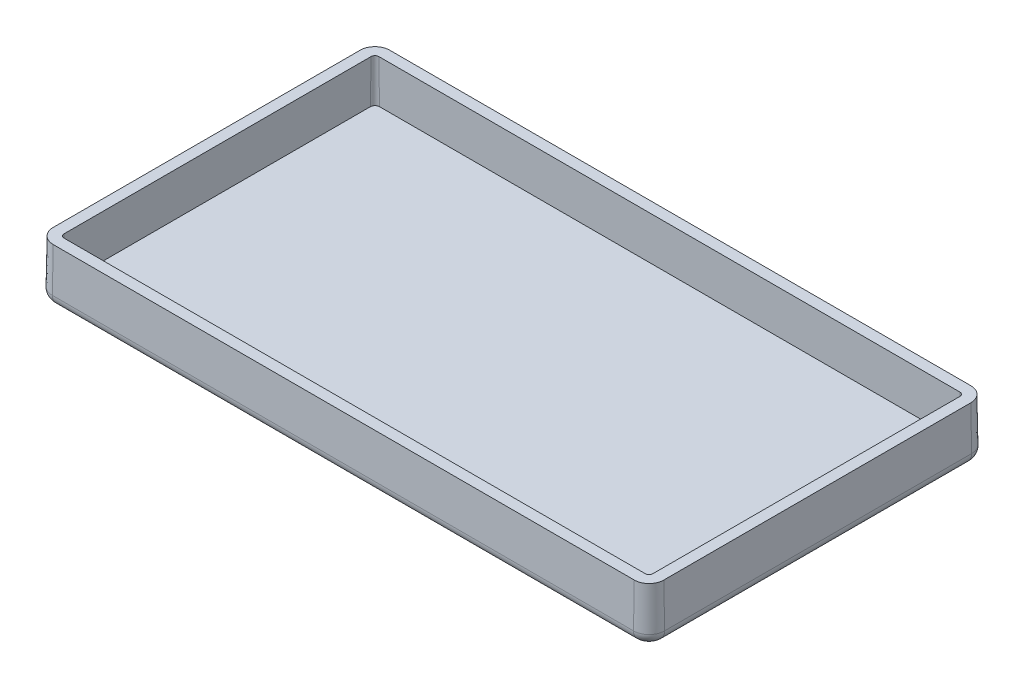
ISO-10303-21;
HEADER;
FILE_DESCRIPTION(('STEP AP214'),'2;1');
FILE_NAME('part.step','',(''),(''),'','','');
FILE_SCHEMA(('AUTOMOTIVE_DESIGN { 1 0 10303 214 1 1 1 1 }'));
ENDSEC;
DATA;
#1=APPLICATION_CONTEXT('core data for automotive mechanical design processes');
#2=APPLICATION_PROTOCOL_DEFINITION('international standard','automotive_design',2000,#1);
#3=PRODUCT_CONTEXT('',#1,'mechanical');
#4=PRODUCT('Part','Part','',(#3));
#5=PRODUCT_RELATED_PRODUCT_CATEGORY('part','',(#4));
#6=PRODUCT_DEFINITION_FORMATION('','',#4);
#7=PRODUCT_DEFINITION_CONTEXT('part definition',#1,'design');
#8=PRODUCT_DEFINITION('design','',#6,#7);
#9=PRODUCT_DEFINITION_SHAPE('','',#8);
#10=(LENGTH_UNIT() NAMED_UNIT(*) SI_UNIT(.MILLI.,.METRE.));
#11=(NAMED_UNIT(*) PLANE_ANGLE_UNIT() SI_UNIT($,.RADIAN.));
#12=(NAMED_UNIT(*) SI_UNIT($,.STERADIAN.) SOLID_ANGLE_UNIT());
#13=UNCERTAINTY_MEASURE_WITH_UNIT(LENGTH_MEASURE(1.E-05),#10,'distance_accuracy_value','');
#14=(GEOMETRIC_REPRESENTATION_CONTEXT(3) GLOBAL_UNCERTAINTY_ASSIGNED_CONTEXT((#13)) GLOBAL_UNIT_ASSIGNED_CONTEXT((#10,
#11,#12)) REPRESENTATION_CONTEXT('',''));
#15=CARTESIAN_POINT('',(0.,0.,0.));
#16=DIRECTION('',(0.,0.,1.));
#17=DIRECTION('',(1.,0.,0.));
#18=AXIS2_PLACEMENT_3D('',#15,#16,#17);
#19=CARTESIAN_POINT('',(0.,10.,0.));
#20=DIRECTION('',(0.,1.,0.));
#21=DIRECTION('',(0.,0.,1.));
#22=AXIS2_PLACEMENT_3D('',#19,#20,#21);
#23=PLANE('',#22);
#24=DIRECTION('',(0.,0.,1.));
#25=VECTOR('',#24,1.);
#26=CARTESIAN_POINT('',(55.6982025971287,10.,-28.));
#27=LINE('',#26,#25);
#28=CARTESIAN_POINT('',(55.6982025971287,10.,28.));
#29=VERTEX_POINT('',#28);
#30=CARTESIAN_POINT('',(55.6982025971287,10.,-28.));
#31=VERTEX_POINT('',#30);
#32=EDGE_CURVE('E175',#29,#31,#27,.F.);
#33=ORIENTED_EDGE('',*,*,#32,.T.);
#34=CARTESIAN_POINT('',(53.,10.,-28.));
#35=DIRECTION('',(0.,1.,0.));
#36=DIRECTION('',(0.,0.,1.));
#37=AXIS2_PLACEMENT_3D('',#34,#35,#36);
#38=CIRCLE('',#37,2.69820259712871);
#39=CARTESIAN_POINT('',(53.,10.,-30.6982025971287));
#40=VERTEX_POINT('',#39);
#41=EDGE_CURVE('E184',#31,#40,#38,.T.);
#42=ORIENTED_EDGE('',*,*,#41,.T.);
#43=DIRECTION('',(1.,0.,0.));
#44=VECTOR('',#43,1.);
#45=CARTESIAN_POINT('',(-53.,10.,-30.6982025971287));
#46=LINE('',#45,#44);
#47=CARTESIAN_POINT('',(-53.,10.,-30.6982025971287));
#48=VERTEX_POINT('',#47);
#49=EDGE_CURVE('E191',#40,#48,#46,.F.);
#50=ORIENTED_EDGE('',*,*,#49,.T.);
#51=CARTESIAN_POINT('',(-53.,10.,-28.));
#52=DIRECTION('',(0.,1.,0.));
#53=DIRECTION('',(0.,0.,1.));
#54=AXIS2_PLACEMENT_3D('',#51,#52,#53);
#55=CIRCLE('',#54,2.69820259712871);
#56=CARTESIAN_POINT('',(-55.6982025971287,10.,-28.));
#57=VERTEX_POINT('',#56);
#58=EDGE_CURVE('E318',#48,#57,#55,.T.);
#59=ORIENTED_EDGE('',*,*,#58,.T.);
#60=DIRECTION('',(0.,0.,-1.));
#61=VECTOR('',#60,1.);
#62=CARTESIAN_POINT('',(-55.6982025971287,10.,-28.));
#63=LINE('',#62,#61);
#64=CARTESIAN_POINT('',(-55.6982025971287,10.,28.));
#65=VERTEX_POINT('',#64);
#66=EDGE_CURVE('E321',#57,#65,#63,.F.);
#67=ORIENTED_EDGE('',*,*,#66,.T.);
#68=CARTESIAN_POINT('',(-53.,10.,28.));
#69=DIRECTION('',(0.,1.,0.));
#70=DIRECTION('',(0.,0.,1.));
#71=AXIS2_PLACEMENT_3D('',#68,#69,#70);
#72=CIRCLE('',#71,2.69820259712871);
#73=CARTESIAN_POINT('',(-53.,10.,30.6982025971287));
#74=VERTEX_POINT('',#73);
#75=EDGE_CURVE('E324',#65,#74,#72,.T.);
#76=ORIENTED_EDGE('',*,*,#75,.T.);
#77=DIRECTION('',(-1.,0.,0.));
#78=VECTOR('',#77,1.);
#79=CARTESIAN_POINT('',(-53.,10.,30.6982025971287));
#80=LINE('',#79,#78);
#81=CARTESIAN_POINT('',(53.,10.,30.6982025971287));
#82=VERTEX_POINT('',#81);
#83=EDGE_CURVE('E199',#74,#82,#80,.F.);
#84=ORIENTED_EDGE('',*,*,#83,.T.);
#85=CARTESIAN_POINT('',(53.,10.,28.));
#86=DIRECTION('',(0.,1.,0.));
#87=DIRECTION('',(0.,0.,1.));
#88=AXIS2_PLACEMENT_3D('',#85,#86,#87);
#89=CIRCLE('',#88,2.69820259712871);
#90=EDGE_CURVE('E197',#82,#29,#89,.T.);
#91=ORIENTED_EDGE('',*,*,#90,.T.);
#92=EDGE_LOOP('',(#33,#42,#50,#59,#67,#76,#84,#91));
#93=FACE_BOUND('',#92,.T.);
#94=CARTESIAN_POINT('',(53.,10.,-28.));
#95=DIRECTION('',(0.,1.,0.));
#96=DIRECTION('',(0.,0.,1.));
#97=AXIS2_PLACEMENT_3D('',#94,#95,#96);
#98=CIRCLE('',#97,0.697897941040891);
#99=CARTESIAN_POINT('',(53.6978979410409,10.,-28.));
#100=VERTEX_POINT('',#99);
#101=CARTESIAN_POINT('',(53.,10.,-28.6978979410409));
#102=VERTEX_POINT('',#101);
#103=EDGE_CURVE('E190',#100,#102,#98,.T.);
#104=ORIENTED_EDGE('',*,*,#103,.F.);
#105=DIRECTION('',(0.,0.,1.));
#106=VECTOR('',#105,1.);
#107=CARTESIAN_POINT('',(53.6978979410409,10.,-28.));
#108=LINE('',#107,#106);
#109=CARTESIAN_POINT('',(53.6978979410409,10.,28.));
#110=VERTEX_POINT('',#109);
#111=EDGE_CURVE('E294',#110,#100,#108,.F.);
#112=ORIENTED_EDGE('',*,*,#111,.F.);
#113=CARTESIAN_POINT('',(53.,10.,28.));
#114=DIRECTION('',(0.,1.,0.));
#115=DIRECTION('',(0.,0.,1.));
#116=AXIS2_PLACEMENT_3D('',#113,#114,#115);
#117=CIRCLE('',#116,0.697897941040891);
#118=CARTESIAN_POINT('',(53.,10.,28.6978979410409));
#119=VERTEX_POINT('',#118);
#120=EDGE_CURVE('E297',#119,#110,#117,.T.);
#121=ORIENTED_EDGE('',*,*,#120,.F.);
#122=DIRECTION('',(-1.,0.,0.));
#123=VECTOR('',#122,1.);
#124=CARTESIAN_POINT('',(-53.,10.,28.6978979410409));
#125=LINE('',#124,#123);
#126=CARTESIAN_POINT('',(-53.,10.,28.6978979410409));
#127=VERTEX_POINT('',#126);
#128=EDGE_CURVE('E300',#127,#119,#125,.F.);
#129=ORIENTED_EDGE('',*,*,#128,.F.);
#130=CARTESIAN_POINT('',(-53.,10.,28.));
#131=DIRECTION('',(0.,1.,0.));
#132=DIRECTION('',(0.,0.,1.));
#133=AXIS2_PLACEMENT_3D('',#130,#131,#132);
#134=CIRCLE('',#133,0.697897941040895);
#135=CARTESIAN_POINT('',(-53.6978979410409,10.,28.));
#136=VERTEX_POINT('',#135);
#137=EDGE_CURVE('E303',#136,#127,#134,.T.);
#138=ORIENTED_EDGE('',*,*,#137,.F.);
#139=DIRECTION('',(0.,0.,-1.));
#140=VECTOR('',#139,1.);
#141=CARTESIAN_POINT('',(-53.6978979410409,10.,-28.));
#142=LINE('',#141,#140);
#143=CARTESIAN_POINT('',(-53.6978979410409,10.,-28.));
#144=VERTEX_POINT('',#143);
#145=EDGE_CURVE('E306',#144,#136,#142,.F.);
#146=ORIENTED_EDGE('',*,*,#145,.F.);
#147=CARTESIAN_POINT('',(-53.,10.,-28.));
#148=DIRECTION('',(0.,1.,0.));
#149=DIRECTION('',(0.,0.,1.));
#150=AXIS2_PLACEMENT_3D('',#147,#148,#149);
#151=CIRCLE('',#150,0.697897941040895);
#152=CARTESIAN_POINT('',(-53.,10.,-28.6978979410409));
#153=VERTEX_POINT('',#152);
#154=EDGE_CURVE('E309',#153,#144,#151,.T.);
#155=ORIENTED_EDGE('',*,*,#154,.F.);
#156=DIRECTION('',(1.,0.,0.));
#157=VECTOR('',#156,1.);
#158=CARTESIAN_POINT('',(-53.,10.,-28.6978979410409));
#159=LINE('',#158,#157);
#160=EDGE_CURVE('E312',#102,#153,#159,.F.);
#161=ORIENTED_EDGE('',*,*,#160,.F.);
#162=EDGE_LOOP('',(#104,#112,#121,#129,#138,#146,#155,#161));
#163=FACE_BOUND('',#162,.T.);
#164=ADVANCED_FACE('F33',(#93,#163),#23,.T.);
#165=CARTESIAN_POINT('',(-53.,24.9650951871254,-28.4366812328927));
#166=DIRECTION('',(0.,0.0174524064372835,-0.999847695156391));
#167=DIRECTION('',(0.,0.999847695156391,0.0174524064372835));
#168=AXIS2_PLACEMENT_3D('',#165,#166,#167);
#169=PLANE('',#168);
#170=DIRECTION('',(0.,0.999847695156391,0.0174524064372835));
#171=VECTOR('',#170,1.);
#172=CARTESIAN_POINT('',(53.,24.9650951871254,-28.4366812328927));
#173=LINE('',#172,#171);
#174=CARTESIAN_POINT('',(53.,2.,-28.8375384604666));
#175=VERTEX_POINT('',#174);
#176=EDGE_CURVE('E218',#102,#175,#173,.F.);
#177=ORIENTED_EDGE('',*,*,#176,.F.);
#178=ORIENTED_EDGE('',*,*,#160,.T.);
#179=DIRECTION('',(0.,-0.999847695156391,-0.0174524064372835));
#180=VECTOR('',#179,1.);
#181=CARTESIAN_POINT('',(-53.,24.9650951871254,-28.4366812328927));
#182=LINE('',#181,#180);
#183=CARTESIAN_POINT('',(-53.,2.,-28.8375384604666));
#184=VERTEX_POINT('',#183);
#185=EDGE_CURVE('E216',#153,#184,#182,.T.);
#186=ORIENTED_EDGE('',*,*,#185,.T.);
#187=DIRECTION('',(-1.,0.,0.));
#188=VECTOR('',#187,1.);
#189=CARTESIAN_POINT('',(53.,2.,-28.8375384604666));
#190=LINE('',#189,#188);
#191=EDGE_CURVE('E358',#184,#175,#190,.F.);
#192=ORIENTED_EDGE('',*,*,#191,.T.);
#193=EDGE_LOOP('',(#177,#178,#186,#192));
#194=FACE_BOUND('',#193,.T.);
#195=ADVANCED_FACE('F393',(#194),#169,.F.);
#196=CARTESIAN_POINT('',(-53.,24.9650951871254,-28.));
#197=DIRECTION('',(0.,-1.,0.));
#198=DIRECTION('',(0.,0.,1.));
#199=AXIS2_PLACEMENT_3D('',#196,#197,#198);
#200=CONICAL_SURFACE('',#199,0.436681232892663,0.0174532925199433);
#201=ORIENTED_EDGE('',*,*,#185,.F.);
#202=ORIENTED_EDGE('',*,*,#154,.T.);
#203=DIRECTION('',(-0.0174524064372835,-0.999847695156391,0.));
#204=VECTOR('',#203,1.);
#205=CARTESIAN_POINT('',(-53.4366812328927,24.9650951871254,-28.));
#206=LINE('',#205,#204);
#207=CARTESIAN_POINT('',(-53.8375384604666,2.,-28.));
#208=VERTEX_POINT('',#207);
#209=EDGE_CURVE('E214',#144,#208,#206,.T.);
#210=ORIENTED_EDGE('',*,*,#209,.T.);
#211=CARTESIAN_POINT('',(-53.,2.,-28.));
#212=DIRECTION('',(0.,1.,0.));
#213=DIRECTION('',(0.,0.,1.));
#214=AXIS2_PLACEMENT_3D('',#211,#212,#213);
#215=CIRCLE('',#214,0.837538460466636);
#216=EDGE_CURVE('E361',#208,#184,#215,.F.);
#217=ORIENTED_EDGE('',*,*,#216,.T.);
#218=EDGE_LOOP('',(#201,#202,#210,#217));
#219=FACE_BOUND('',#218,.T.);
#220=ADVANCED_FACE('F396',(#219),#200,.F.);
#221=CARTESIAN_POINT('',(-53.4366812328927,24.9650951871254,-28.));
#222=DIRECTION('',(-0.999847695156391,0.0174524064372835,0.));
#223=DIRECTION('',(-0.0174524064372835,-0.999847695156391,0.));
#224=AXIS2_PLACEMENT_3D('',#221,#222,#223);
#225=PLANE('',#224);
#226=ORIENTED_EDGE('',*,*,#209,.F.);
#227=ORIENTED_EDGE('',*,*,#145,.T.);
#228=DIRECTION('',(-0.0174524064372835,-0.999847695156391,0.));
#229=VECTOR('',#228,1.);
#230=CARTESIAN_POINT('',(-53.4366812328927,24.9650951871254,28.));
#231=LINE('',#230,#229);
#232=CARTESIAN_POINT('',(-53.8375384604666,2.,28.));
#233=VERTEX_POINT('',#232);
#234=EDGE_CURVE('E212',#136,#233,#231,.T.);
#235=ORIENTED_EDGE('',*,*,#234,.T.);
#236=DIRECTION('',(0.,0.,1.));
#237=VECTOR('',#236,1.);
#238=CARTESIAN_POINT('',(-53.8375384604666,2.,-28.));
#239=LINE('',#238,#237);
#240=EDGE_CURVE('E296',#233,#208,#239,.F.);
#241=ORIENTED_EDGE('',*,*,#240,.T.);
#242=EDGE_LOOP('',(#226,#227,#235,#241));
#243=FACE_BOUND('',#242,.T.);
#244=ADVANCED_FACE('F399',(#243),#225,.F.);
#245=CARTESIAN_POINT('',(-53.,24.9650951871254,28.));
#246=DIRECTION('',(0.,-1.,0.));
#247=DIRECTION('',(0.,0.,1.));
#248=AXIS2_PLACEMENT_3D('',#245,#246,#247);
#249=CONICAL_SURFACE('',#248,0.436681232892663,0.0174532925199433);
#250=ORIENTED_EDGE('',*,*,#234,.F.);
#251=ORIENTED_EDGE('',*,*,#137,.T.);
#252=DIRECTION('',(0.,-0.999847695156391,0.0174524064372835));
#253=VECTOR('',#252,1.);
#254=CARTESIAN_POINT('',(-53.,24.9650951871254,28.4366812328927));
#255=LINE('',#254,#253);
#256=CARTESIAN_POINT('',(-53.,2.,28.8375384604666));
#257=VERTEX_POINT('',#256);
#258=EDGE_CURVE('E210',#127,#257,#255,.T.);
#259=ORIENTED_EDGE('',*,*,#258,.T.);
#260=CARTESIAN_POINT('',(-53.,2.,28.));
#261=DIRECTION('',(0.,1.,0.));
#262=DIRECTION('',(0.,0.,1.));
#263=AXIS2_PLACEMENT_3D('',#260,#261,#262);
#264=CIRCLE('',#263,0.837538460466636);
#265=EDGE_CURVE('E352',#257,#233,#264,.F.);
#266=ORIENTED_EDGE('',*,*,#265,.T.);
#267=EDGE_LOOP('',(#250,#251,#259,#266));
#268=FACE_BOUND('',#267,.T.);
#269=ADVANCED_FACE('F402',(#268),#249,.F.);
#270=CARTESIAN_POINT('',(-53.,24.9650951871254,28.4366812328927));
#271=DIRECTION('',(0.,0.0174524064372835,0.999847695156391));
#272=DIRECTION('',(0.,-0.999847695156391,0.0174524064372835));
#273=AXIS2_PLACEMENT_3D('',#270,#271,#272);
#274=PLANE('',#273);
#275=ORIENTED_EDGE('',*,*,#258,.F.);
#276=ORIENTED_EDGE('',*,*,#128,.T.);
#277=DIRECTION('',(0.,-0.999847695156391,0.0174524064372835));
#278=VECTOR('',#277,1.);
#279=CARTESIAN_POINT('',(53.,24.9650951871254,28.4366812328927));
#280=LINE('',#279,#278);
#281=CARTESIAN_POINT('',(53.,2.,28.8375384604666));
#282=VERTEX_POINT('',#281);
#283=EDGE_CURVE('E207',#119,#282,#280,.T.);
#284=ORIENTED_EDGE('',*,*,#283,.T.);
#285=DIRECTION('',(-1.,0.,0.));
#286=VECTOR('',#285,1.);
#287=CARTESIAN_POINT('',(-53.,2.,28.8375384604666));
#288=LINE('',#287,#286);
#289=EDGE_CURVE('E209',#257,#282,#288,.F.);
#290=ORIENTED_EDGE('',*,*,#289,.F.);
#291=EDGE_LOOP('',(#275,#276,#284,#290));
#292=FACE_BOUND('',#291,.T.);
#293=ADVANCED_FACE('F403',(#292),#274,.F.);
#294=CARTESIAN_POINT('',(53.,2.,-28.));
#295=DIRECTION('',(0.,1.,0.));
#296=DIRECTION('',(0.,0.,1.));
#297=AXIS2_PLACEMENT_3D('',#294,#295,#296);
#298=PLANE('',#297);
#299=ORIENTED_EDGE('',*,*,#216,.F.);
#300=ORIENTED_EDGE('',*,*,#240,.F.);
#301=ORIENTED_EDGE('',*,*,#265,.F.);
#302=ORIENTED_EDGE('',*,*,#289,.T.);
#303=CARTESIAN_POINT('',(53.,2.,28.));
#304=DIRECTION('',(0.,1.,0.));
#305=DIRECTION('',(0.,0.,1.));
#306=AXIS2_PLACEMENT_3D('',#303,#304,#305);
#307=CIRCLE('',#306,0.837538460466632);
#308=CARTESIAN_POINT('',(53.8375384604666,2.,28.));
#309=VERTEX_POINT('',#308);
#310=EDGE_CURVE('E205',#282,#309,#307,.T.);
#311=ORIENTED_EDGE('',*,*,#310,.T.);
#312=DIRECTION('',(0.,0.,1.));
#313=VECTOR('',#312,1.);
#314=CARTESIAN_POINT('',(53.8375384604666,2.,-28.));
#315=LINE('',#314,#313);
#316=CARTESIAN_POINT('',(53.8375384604666,2.,-28.));
#317=VERTEX_POINT('',#316);
#318=EDGE_CURVE('E206',#309,#317,#315,.F.);
#319=ORIENTED_EDGE('',*,*,#318,.T.);
#320=CARTESIAN_POINT('',(53.,2.,-28.));
#321=DIRECTION('',(0.,1.,0.));
#322=DIRECTION('',(0.,0.,1.));
#323=AXIS2_PLACEMENT_3D('',#320,#321,#322);
#324=CIRCLE('',#323,0.837538460466632);
#325=EDGE_CURVE('E355',#175,#317,#324,.F.);
#326=ORIENTED_EDGE('',*,*,#325,.F.);
#327=ORIENTED_EDGE('',*,*,#191,.F.);
#328=EDGE_LOOP('',(#299,#300,#301,#302,#311,#319,#326,#327));
#329=FACE_BOUND('',#328,.T.);
#330=ADVANCED_FACE('F374',(#329),#298,.T.);
#331=CARTESIAN_POINT('',(53.,24.9650951871254,-28.));
#332=DIRECTION('',(0.,-1.,0.));
#333=DIRECTION('',(0.,0.,1.));
#334=AXIS2_PLACEMENT_3D('',#331,#332,#333);
#335=CONICAL_SURFACE('',#334,0.43668123289266,0.0174532925199433);
#336=DIRECTION('',(0.0174524064372835,-0.999847695156391,0.));
#337=VECTOR('',#336,1.);
#338=CARTESIAN_POINT('',(53.4366812328927,24.9650951871254,-28.));
#339=LINE('',#338,#337);
#340=EDGE_CURVE('E220',#100,#317,#339,.T.);
#341=ORIENTED_EDGE('',*,*,#340,.F.);
#342=ORIENTED_EDGE('',*,*,#103,.T.);
#343=ORIENTED_EDGE('',*,*,#176,.T.);
#344=ORIENTED_EDGE('',*,*,#325,.T.);
#345=EDGE_LOOP('',(#341,#342,#343,#344));
#346=FACE_BOUND('',#345,.T.);
#347=ADVANCED_FACE('F390',(#346),#335,.F.);
#348=CARTESIAN_POINT('',(53.,24.9650951871254,28.));
#349=DIRECTION('',(0.,-1.,0.));
#350=DIRECTION('',(0.,0.,1.));
#351=AXIS2_PLACEMENT_3D('',#348,#349,#350);
#352=CONICAL_SURFACE('',#351,0.43668123289266,0.0174532925199433);
#353=ORIENTED_EDGE('',*,*,#283,.F.);
#354=ORIENTED_EDGE('',*,*,#120,.T.);
#355=DIRECTION('',(-0.0174524064372835,0.999847695156391,0.));
#356=VECTOR('',#355,1.);
#357=CARTESIAN_POINT('',(53.4366812328927,24.9650951871254,28.));
#358=LINE('',#357,#356);
#359=EDGE_CURVE('E203',#110,#309,#358,.F.);
#360=ORIENTED_EDGE('',*,*,#359,.T.);
#361=ORIENTED_EDGE('',*,*,#310,.F.);
#362=EDGE_LOOP('',(#353,#354,#360,#361));
#363=FACE_BOUND('',#362,.T.);
#364=ADVANCED_FACE('F381',(#363),#352,.F.);
#365=CARTESIAN_POINT('',(53.4366812328927,24.9650951871254,-28.));
#366=DIRECTION('',(0.999847695156391,0.0174524064372835,0.));
#367=DIRECTION('',(-0.0174524064372835,0.999847695156391,0.));
#368=AXIS2_PLACEMENT_3D('',#365,#366,#367);
#369=PLANE('',#368);
#370=ORIENTED_EDGE('',*,*,#359,.F.);
#371=ORIENTED_EDGE('',*,*,#111,.T.);
#372=ORIENTED_EDGE('',*,*,#340,.T.);
#373=ORIENTED_EDGE('',*,*,#318,.F.);
#374=EDGE_LOOP('',(#370,#371,#372,#373));
#375=FACE_BOUND('',#374,.T.);
#376=ADVANCED_FACE('F384',(#375),#369,.F.);
#377=CARTESIAN_POINT('',(53.,25.,-28.));
#378=DIRECTION('',(0.,-1.,0.));
#379=DIRECTION('',(0.,0.,1.));
#380=AXIS2_PLACEMENT_3D('',#377,#378,#379);
#381=CONICAL_SURFACE('',#380,2.43637662320544,0.0174532925199433);
#382=ORIENTED_EDGE('',*,*,#41,.F.);
#383=DIRECTION('',(0.0174524064372835,-0.999847695156391,0.));
#384=VECTOR('',#383,1.);
#385=CARTESIAN_POINT('',(55.4363766232054,25.,-28.));
#386=LINE('',#385,#384);
#387=CARTESIAN_POINT('',(55.8372338507794,2.03490481287457,-28.));
#388=VERTEX_POINT('',#387);
#389=EDGE_CURVE('E37',#31,#388,#386,.T.);
#390=ORIENTED_EDGE('',*,*,#389,.T.);
#391=CARTESIAN_POINT('',(53.,2.03490481287458,-28.));
#392=DIRECTION('',(0.,1.,0.));
#393=DIRECTION('',(0.,0.,1.));
#394=AXIS2_PLACEMENT_3D('',#391,#392,#393);
#395=CIRCLE('',#394,2.83723385077941);
#396=CARTESIAN_POINT('',(53.,2.03490481287457,-30.8372338507794));
#397=VERTEX_POINT('',#396);
#398=EDGE_CURVE('E241',#388,#397,#395,.T.);
#399=ORIENTED_EDGE('',*,*,#398,.T.);
#400=DIRECTION('',(0.,-0.999847695156391,-0.0174524064372835));
#401=VECTOR('',#400,1.);
#402=CARTESIAN_POINT('',(53.,25.,-30.4363766232054));
#403=LINE('',#402,#401);
#404=EDGE_CURVE('E186',#40,#397,#403,.T.);
#405=ORIENTED_EDGE('',*,*,#404,.F.);
#406=EDGE_LOOP('',(#382,#390,#399,#405));
#407=FACE_BOUND('',#406,.T.);
#408=ADVANCED_FACE('F185',(#407),#381,.T.);
#409=CARTESIAN_POINT('',(-53.,25.,-30.4363766232054));
#410=DIRECTION('',(0.,0.0174524064372835,-0.999847695156391));
#411=DIRECTION('',(0.,0.999847695156391,0.0174524064372835));
#412=AXIS2_PLACEMENT_3D('',#409,#410,#411);
#413=PLANE('',#412);
#414=ORIENTED_EDGE('',*,*,#49,.F.);
#415=ORIENTED_EDGE('',*,*,#404,.T.);
#416=DIRECTION('',(-1.,0.,0.));
#417=VECTOR('',#416,1.);
#418=CARTESIAN_POINT('',(-53.,2.03490481287457,-30.8372338507794));
#419=LINE('',#418,#417);
#420=CARTESIAN_POINT('',(-53.,2.03490481287457,-30.8372338507794));
#421=VERTEX_POINT('',#420);
#422=EDGE_CURVE('E253',#397,#421,#419,.T.);
#423=ORIENTED_EDGE('',*,*,#422,.T.);
#424=DIRECTION('',(0.,-0.999847695156391,-0.0174524064372835));
#425=VECTOR('',#424,1.);
#426=CARTESIAN_POINT('',(-53.,25.,-30.4363766232054));
#427=LINE('',#426,#425);
#428=EDGE_CURVE('E224',#48,#421,#427,.T.);
#429=ORIENTED_EDGE('',*,*,#428,.F.);
#430=EDGE_LOOP('',(#414,#415,#423,#429));
#431=FACE_BOUND('',#430,.T.);
#432=ADVANCED_FACE('F436',(#431),#413,.T.);
#433=CARTESIAN_POINT('',(-53.,25.,-28.));
#434=DIRECTION('',(0.,-1.,0.));
#435=DIRECTION('',(0.,0.,1.));
#436=AXIS2_PLACEMENT_3D('',#433,#434,#435);
#437=CONICAL_SURFACE('',#436,2.43637662320545,0.0174532925199433);
#438=ORIENTED_EDGE('',*,*,#58,.F.);
#439=ORIENTED_EDGE('',*,*,#428,.T.);
#440=CARTESIAN_POINT('',(-53.,2.03490481287458,-28.));
#441=DIRECTION('',(0.,1.,0.));
#442=DIRECTION('',(0.,0.,1.));
#443=AXIS2_PLACEMENT_3D('',#440,#441,#442);
#444=CIRCLE('',#443,2.83723385077942);
#445=CARTESIAN_POINT('',(-55.8372338507794,2.03490481287457,-28.));
#446=VERTEX_POINT('',#445);
#447=EDGE_CURVE('E274',#421,#446,#444,.T.);
#448=ORIENTED_EDGE('',*,*,#447,.T.);
#449=DIRECTION('',(-0.0174524064372835,-0.999847695156391,0.));
#450=VECTOR('',#449,1.);
#451=CARTESIAN_POINT('',(-55.4363766232055,25.,-28.));
#452=LINE('',#451,#450);
#453=EDGE_CURVE('E227',#57,#446,#452,.T.);
#454=ORIENTED_EDGE('',*,*,#453,.F.);
#455=EDGE_LOOP('',(#438,#439,#448,#454));
#456=FACE_BOUND('',#455,.T.);
#457=ADVANCED_FACE('F443',(#456),#437,.T.);
#458=CARTESIAN_POINT('',(-55.4363766232055,25.,-28.));
#459=DIRECTION('',(-0.999847695156391,0.0174524064372835,0.));
#460=DIRECTION('',(-0.0174524064372835,-0.999847695156391,0.));
#461=AXIS2_PLACEMENT_3D('',#458,#459,#460);
#462=PLANE('',#461);
#463=ORIENTED_EDGE('',*,*,#66,.F.);
#464=ORIENTED_EDGE('',*,*,#453,.T.);
#465=DIRECTION('',(0.,0.,1.));
#466=VECTOR('',#465,1.);
#467=CARTESIAN_POINT('',(-55.8372338507794,2.03490481287457,-28.));
#468=LINE('',#467,#466);
#469=CARTESIAN_POINT('',(-55.8372338507794,2.03490481287457,28.));
#470=VERTEX_POINT('',#469);
#471=EDGE_CURVE('E242',#446,#470,#468,.T.);
#472=ORIENTED_EDGE('',*,*,#471,.T.);
#473=DIRECTION('',(-0.0174524064372835,-0.999847695156391,0.));
#474=VECTOR('',#473,1.);
#475=CARTESIAN_POINT('',(-55.4363766232054,25.,28.));
#476=LINE('',#475,#474);
#477=EDGE_CURVE('E57',#65,#470,#476,.T.);
#478=ORIENTED_EDGE('',*,*,#477,.F.);
#479=EDGE_LOOP('',(#463,#464,#472,#478));
#480=FACE_BOUND('',#479,.T.);
#481=ADVANCED_FACE('F440',(#480),#462,.T.);
#482=CARTESIAN_POINT('',(-53.,25.,28.));
#483=DIRECTION('',(0.,-1.,0.));
#484=DIRECTION('',(0.,0.,1.));
#485=AXIS2_PLACEMENT_3D('',#482,#483,#484);
#486=CONICAL_SURFACE('',#485,2.43637662320545,0.0174532925199433);
#487=ORIENTED_EDGE('',*,*,#75,.F.);
#488=ORIENTED_EDGE('',*,*,#477,.T.);
#489=CARTESIAN_POINT('',(-53.,2.03490481287455,28.));
#490=DIRECTION('',(0.,1.,0.));
#491=DIRECTION('',(0.,0.,1.));
#492=AXIS2_PLACEMENT_3D('',#489,#490,#491);
#493=CIRCLE('',#492,2.83723385077942);
#494=CARTESIAN_POINT('',(-53.,2.03490481287457,30.8372338507794));
#495=VERTEX_POINT('',#494);
#496=EDGE_CURVE('E225',#470,#495,#493,.T.);
#497=ORIENTED_EDGE('',*,*,#496,.T.);
#498=DIRECTION('',(0.,-0.999847695156391,0.0174524064372835));
#499=VECTOR('',#498,1.);
#500=CARTESIAN_POINT('',(-53.,25.,30.4363766232054));
#501=LINE('',#500,#499);
#502=EDGE_CURVE('E50',#74,#495,#501,.T.);
#503=ORIENTED_EDGE('',*,*,#502,.F.);
#504=EDGE_LOOP('',(#487,#488,#497,#503));
#505=FACE_BOUND('',#504,.T.);
#506=ADVANCED_FACE('F333',(#505),#486,.T.);
#507=CARTESIAN_POINT('',(-53.,25.,30.4363766232054));
#508=DIRECTION('',(0.,0.0174524064372835,0.999847695156391));
#509=DIRECTION('',(0.,-0.999847695156391,0.0174524064372835));
#510=AXIS2_PLACEMENT_3D('',#507,#508,#509);
#511=PLANE('',#510);
#512=ORIENTED_EDGE('',*,*,#83,.F.);
#513=ORIENTED_EDGE('',*,*,#502,.T.);
#514=DIRECTION('',(1.,0.,0.));
#515=VECTOR('',#514,1.);
#516=CARTESIAN_POINT('',(-53.,2.03490481287457,30.8372338507794));
#517=LINE('',#516,#515);
#518=CARTESIAN_POINT('',(53.,2.03490481287457,30.8372338507794));
#519=VERTEX_POINT('',#518);
#520=EDGE_CURVE('E222',#495,#519,#517,.T.);
#521=ORIENTED_EDGE('',*,*,#520,.T.);
#522=DIRECTION('',(0.,-0.999847695156391,0.0174524064372835));
#523=VECTOR('',#522,1.);
#524=CARTESIAN_POINT('',(53.,25.,30.4363766232054));
#525=LINE('',#524,#523);
#526=EDGE_CURVE('E231',#82,#519,#525,.T.);
#527=ORIENTED_EDGE('',*,*,#526,.F.);
#528=EDGE_LOOP('',(#512,#513,#521,#527));
#529=FACE_BOUND('',#528,.T.);
#530=ADVANCED_FACE('F326',(#529),#511,.T.);
#531=CARTESIAN_POINT('',(53.,25.,28.));
#532=DIRECTION('',(0.,-1.,0.));
#533=DIRECTION('',(0.,0.,1.));
#534=AXIS2_PLACEMENT_3D('',#531,#532,#533);
#535=CONICAL_SURFACE('',#534,2.43637662320544,0.0174532925199433);
#536=ORIENTED_EDGE('',*,*,#90,.F.);
#537=ORIENTED_EDGE('',*,*,#526,.T.);
#538=CARTESIAN_POINT('',(53.,2.03490481287458,28.));
#539=DIRECTION('',(0.,1.,0.));
#540=DIRECTION('',(0.,0.,1.));
#541=AXIS2_PLACEMENT_3D('',#538,#539,#540);
#542=CIRCLE('',#541,2.83723385077941);
#543=CARTESIAN_POINT('',(55.8372338507794,2.03490481287457,28.));
#544=VERTEX_POINT('',#543);
#545=EDGE_CURVE('E235',#519,#544,#542,.T.);
#546=ORIENTED_EDGE('',*,*,#545,.T.);
#547=DIRECTION('',(0.0174524064372835,-0.999847695156391,0.));
#548=VECTOR('',#547,1.);
#549=CARTESIAN_POINT('',(55.4363766232054,25.,28.));
#550=LINE('',#549,#548);
#551=EDGE_CURVE('E182',#29,#544,#550,.T.);
#552=ORIENTED_EDGE('',*,*,#551,.F.);
#553=EDGE_LOOP('',(#536,#537,#546,#552));
#554=FACE_BOUND('',#553,.T.);
#555=ADVANCED_FACE('F236',(#554),#535,.T.);
#556=CARTESIAN_POINT('',(55.4363766232054,25.,-28.));
#557=DIRECTION('',(0.999847695156391,0.0174524064372835,0.));
#558=DIRECTION('',(-0.0174524064372835,0.999847695156391,0.));
#559=AXIS2_PLACEMENT_3D('',#556,#557,#558);
#560=PLANE('',#559);
#561=ORIENTED_EDGE('',*,*,#32,.F.);
#562=ORIENTED_EDGE('',*,*,#551,.T.);
#563=DIRECTION('',(0.,0.,-1.));
#564=VECTOR('',#563,1.);
#565=CARTESIAN_POINT('',(55.8372338507794,2.03490481287457,-28.));
#566=LINE('',#565,#564);
#567=EDGE_CURVE('E177',#544,#388,#566,.T.);
#568=ORIENTED_EDGE('',*,*,#567,.T.);
#569=ORIENTED_EDGE('',*,*,#389,.F.);
#570=EDGE_LOOP('',(#561,#562,#568,#569));
#571=FACE_BOUND('',#570,.T.);
#572=ADVANCED_FACE('F35',(#571),#560,.T.);
#573=CARTESIAN_POINT('',(53.,0.,-28.));
#574=DIRECTION('',(0.,1.,0.));
#575=DIRECTION('',(0.,0.,1.));
#576=AXIS2_PLACEMENT_3D('',#573,#574,#575);
#577=PLANE('',#576);
#578=CARTESIAN_POINT('',(-53.,0.,-28.));
#579=DIRECTION('',(0.,1.,0.));
#580=DIRECTION('',(0.,0.,1.));
#581=AXIS2_PLACEMENT_3D('',#578,#579,#580);
#582=CIRCLE('',#581,0.837538460466636);
#583=CARTESIAN_POINT('',(-53.8375384604666,0.,-28.));
#584=VERTEX_POINT('',#583);
#585=CARTESIAN_POINT('',(-53.,0.,-28.8375384604666));
#586=VERTEX_POINT('',#585);
#587=EDGE_CURVE('E279',#584,#586,#582,.F.);
#588=ORIENTED_EDGE('',*,*,#587,.T.);
#589=DIRECTION('',(1.,0.,0.));
#590=VECTOR('',#589,1.);
#591=CARTESIAN_POINT('',(53.,0.,-28.8375384604666));
#592=LINE('',#591,#590);
#593=CARTESIAN_POINT('',(53.,0.,-28.8375384604666));
#594=VERTEX_POINT('',#593);
#595=EDGE_CURVE('E277',#586,#594,#592,.T.);
#596=ORIENTED_EDGE('',*,*,#595,.T.);
#597=CARTESIAN_POINT('',(53.,0.,-28.));
#598=DIRECTION('',(0.,1.,0.));
#599=DIRECTION('',(0.,0.,1.));
#600=AXIS2_PLACEMENT_3D('',#597,#598,#599);
#601=CIRCLE('',#600,0.837538460466632);
#602=CARTESIAN_POINT('',(53.8375384604666,0.,-28.));
#603=VERTEX_POINT('',#602);
#604=EDGE_CURVE('E281',#594,#603,#601,.F.);
#605=ORIENTED_EDGE('',*,*,#604,.T.);
#606=DIRECTION('',(0.,0.,1.));
#607=VECTOR('',#606,1.);
#608=CARTESIAN_POINT('',(53.8375384604666,0.,-28.));
#609=LINE('',#608,#607);
#610=CARTESIAN_POINT('',(53.8375384604666,0.,28.));
#611=VERTEX_POINT('',#610);
#612=EDGE_CURVE('E285',#603,#611,#609,.T.);
#613=ORIENTED_EDGE('',*,*,#612,.T.);
#614=CARTESIAN_POINT('',(53.,0.,28.));
#615=DIRECTION('',(0.,1.,0.));
#616=DIRECTION('',(0.,0.,1.));
#617=AXIS2_PLACEMENT_3D('',#614,#615,#616);
#618=CIRCLE('',#617,0.837538460466632);
#619=CARTESIAN_POINT('',(53.,0.,28.8375384604666));
#620=VERTEX_POINT('',#619);
#621=EDGE_CURVE('E256',#611,#620,#618,.F.);
#622=ORIENTED_EDGE('',*,*,#621,.T.);
#623=DIRECTION('',(-1.,0.,0.));
#624=VECTOR('',#623,1.);
#625=CARTESIAN_POINT('',(53.,0.,28.8375384604666));
#626=LINE('',#625,#624);
#627=CARTESIAN_POINT('',(-53.,0.,28.8375384604666));
#628=VERTEX_POINT('',#627);
#629=EDGE_CURVE('E291',#620,#628,#626,.T.);
#630=ORIENTED_EDGE('',*,*,#629,.T.);
#631=CARTESIAN_POINT('',(-53.,0.,28.));
#632=DIRECTION('',(0.,1.,0.));
#633=DIRECTION('',(0.,0.,1.));
#634=AXIS2_PLACEMENT_3D('',#631,#632,#633);
#635=CIRCLE('',#634,0.837538460466636);
#636=CARTESIAN_POINT('',(-53.8375384604666,0.,28.));
#637=VERTEX_POINT('',#636);
#638=EDGE_CURVE('E287',#628,#637,#635,.F.);
#639=ORIENTED_EDGE('',*,*,#638,.T.);
#640=DIRECTION('',(0.,0.,-1.));
#641=VECTOR('',#640,1.);
#642=CARTESIAN_POINT('',(-53.8375384604666,0.,-28.));
#643=LINE('',#642,#641);
#644=EDGE_CURVE('E283',#637,#584,#643,.T.);
#645=ORIENTED_EDGE('',*,*,#644,.T.);
#646=EDGE_LOOP('',(#588,#596,#605,#613,#622,#630,#639,#645));
#647=FACE_BOUND('',#646,.T.);
#648=ADVANCED_FACE('F340',(#647),#577,.F.);
#649=CARTESIAN_POINT('',(53.,2.,-28.));
#650=DIRECTION('',(0.,1.,0.));
#651=DIRECTION('',(0.,0.,1.));
#652=AXIS2_PLACEMENT_3D('',#649,#650,#651);
#653=DEGENERATE_TOROIDAL_SURFACE('',#652,0.837538460466632,2.,.T.);
#654=CARTESIAN_POINT('',(53.8375384604666,2.,-28.));
#655=DIRECTION('',(0.,0.,1.));
#656=DIRECTION('',(1.,0.,0.));
#657=AXIS2_PLACEMENT_3D('',#654,#655,#656);
#658=CIRCLE('',#657,2.);
#659=EDGE_CURVE('E252',#603,#388,#658,.T.);
#660=ORIENTED_EDGE('',*,*,#659,.F.);
#661=ORIENTED_EDGE('',*,*,#604,.F.);
#662=CARTESIAN_POINT('',(53.,2.,-28.8375384604666));
#663=DIRECTION('',(-1.,0.,0.));
#664=DIRECTION('',(0.,0.,1.));
#665=AXIS2_PLACEMENT_3D('',#662,#663,#664);
#666=CIRCLE('',#665,2.);
#667=EDGE_CURVE('E181',#397,#594,#666,.T.);
#668=ORIENTED_EDGE('',*,*,#667,.F.);
#669=ORIENTED_EDGE('',*,*,#398,.F.);
#670=EDGE_LOOP('',(#660,#661,#668,#669));
#671=FACE_BOUND('',#670,.T.);
#672=ADVANCED_FACE('F347',(#671),#653,.T.);
#673=CARTESIAN_POINT('',(-53.,2.,-28.8375384604666));
#674=DIRECTION('',(1.,0.,0.));
#675=DIRECTION('',(0.,0.,-1.));
#676=AXIS2_PLACEMENT_3D('',#673,#674,#675);
#677=CYLINDRICAL_SURFACE('',#676,2.);
#678=ORIENTED_EDGE('',*,*,#667,.T.);
#679=ORIENTED_EDGE('',*,*,#595,.F.);
#680=CARTESIAN_POINT('',(-53.,2.,-28.8375384604666));
#681=DIRECTION('',(-1.,0.,0.));
#682=DIRECTION('',(0.,0.,1.));
#683=AXIS2_PLACEMENT_3D('',#680,#681,#682);
#684=CIRCLE('',#683,2.);
#685=EDGE_CURVE('E258',#421,#586,#684,.T.);
#686=ORIENTED_EDGE('',*,*,#685,.F.);
#687=ORIENTED_EDGE('',*,*,#422,.F.);
#688=EDGE_LOOP('',(#678,#679,#686,#687));
#689=FACE_BOUND('',#688,.T.);
#690=ADVANCED_FACE('F425',(#689),#677,.T.);
#691=CARTESIAN_POINT('',(53.8375384604666,2.,-28.));
#692=DIRECTION('',(0.,0.,1.));
#693=DIRECTION('',(1.,0.,0.));
#694=AXIS2_PLACEMENT_3D('',#691,#692,#693);
#695=CYLINDRICAL_SURFACE('',#694,2.);
#696=ORIENTED_EDGE('',*,*,#659,.T.);
#697=ORIENTED_EDGE('',*,*,#567,.F.);
#698=CARTESIAN_POINT('',(53.8375384604666,2.,28.));
#699=DIRECTION('',(0.,0.,1.));
#700=DIRECTION('',(1.,0.,0.));
#701=AXIS2_PLACEMENT_3D('',#698,#699,#700);
#702=CIRCLE('',#701,2.);
#703=EDGE_CURVE('E249',#611,#544,#702,.T.);
#704=ORIENTED_EDGE('',*,*,#703,.F.);
#705=ORIENTED_EDGE('',*,*,#612,.F.);
#706=EDGE_LOOP('',(#696,#697,#704,#705));
#707=FACE_BOUND('',#706,.T.);
#708=ADVANCED_FACE('F247',(#707),#695,.T.);
#709=CARTESIAN_POINT('',(-53.,2.,-28.));
#710=DIRECTION('',(0.,1.,0.));
#711=DIRECTION('',(0.,0.,1.));
#712=AXIS2_PLACEMENT_3D('',#709,#710,#711);
#713=DEGENERATE_TOROIDAL_SURFACE('',#712,0.837538460466636,2.,.T.);
#714=ORIENTED_EDGE('',*,*,#685,.T.);
#715=ORIENTED_EDGE('',*,*,#587,.F.);
#716=CARTESIAN_POINT('',(-53.8375384604666,2.,-28.));
#717=DIRECTION('',(0.,0.,1.));
#718=DIRECTION('',(1.,0.,0.));
#719=AXIS2_PLACEMENT_3D('',#716,#717,#718);
#720=CIRCLE('',#719,2.);
#721=EDGE_CURVE('E257',#446,#584,#720,.T.);
#722=ORIENTED_EDGE('',*,*,#721,.F.);
#723=ORIENTED_EDGE('',*,*,#447,.F.);
#724=EDGE_LOOP('',(#714,#715,#722,#723));
#725=FACE_BOUND('',#724,.T.);
#726=ADVANCED_FACE('F475',(#725),#713,.T.);
#727=CARTESIAN_POINT('',(53.,2.,28.));
#728=DIRECTION('',(0.,1.,0.));
#729=DIRECTION('',(0.,0.,1.));
#730=AXIS2_PLACEMENT_3D('',#727,#728,#729);
#731=DEGENERATE_TOROIDAL_SURFACE('',#730,0.837538460466632,2.,.T.);
#732=ORIENTED_EDGE('',*,*,#703,.T.);
#733=ORIENTED_EDGE('',*,*,#545,.F.);
#734=CARTESIAN_POINT('',(53.,2.,28.8375384604666));
#735=DIRECTION('',(-1.,0.,0.));
#736=DIRECTION('',(0.,0.,1.));
#737=AXIS2_PLACEMENT_3D('',#734,#735,#736);
#738=CIRCLE('',#737,2.);
#739=EDGE_CURVE('E261',#620,#519,#738,.T.);
#740=ORIENTED_EDGE('',*,*,#739,.F.);
#741=ORIENTED_EDGE('',*,*,#621,.F.);
#742=EDGE_LOOP('',(#732,#733,#740,#741));
#743=FACE_BOUND('',#742,.T.);
#744=ADVANCED_FACE('F255',(#743),#731,.T.);
#745=CARTESIAN_POINT('',(-53.8375384604666,2.,-28.));
#746=DIRECTION('',(0.,0.,-1.));
#747=DIRECTION('',(-1.,0.,0.));
#748=AXIS2_PLACEMENT_3D('',#745,#746,#747);
#749=CYLINDRICAL_SURFACE('',#748,2.);
#750=ORIENTED_EDGE('',*,*,#721,.T.);
#751=ORIENTED_EDGE('',*,*,#644,.F.);
#752=CARTESIAN_POINT('',(-53.8375384604666,2.,28.));
#753=DIRECTION('',(0.,0.,1.));
#754=DIRECTION('',(1.,0.,0.));
#755=AXIS2_PLACEMENT_3D('',#752,#753,#754);
#756=CIRCLE('',#755,2.);
#757=EDGE_CURVE('E42',#470,#637,#756,.T.);
#758=ORIENTED_EDGE('',*,*,#757,.F.);
#759=ORIENTED_EDGE('',*,*,#471,.F.);
#760=EDGE_LOOP('',(#750,#751,#758,#759));
#761=FACE_BOUND('',#760,.T.);
#762=ADVANCED_FACE('F417',(#761),#749,.T.);
#763=CARTESIAN_POINT('',(-53.,2.,28.8375384604666));
#764=DIRECTION('',(-1.,0.,0.));
#765=DIRECTION('',(0.,0.,1.));
#766=AXIS2_PLACEMENT_3D('',#763,#764,#765);
#767=CYLINDRICAL_SURFACE('',#766,2.);
#768=ORIENTED_EDGE('',*,*,#739,.T.);
#769=ORIENTED_EDGE('',*,*,#520,.F.);
#770=CARTESIAN_POINT('',(-53.,2.,28.8375384604666));
#771=DIRECTION('',(-1.,0.,0.));
#772=DIRECTION('',(0.,0.,1.));
#773=AXIS2_PLACEMENT_3D('',#770,#771,#772);
#774=CIRCLE('',#773,2.);
#775=EDGE_CURVE('E11',#628,#495,#774,.T.);
#776=ORIENTED_EDGE('',*,*,#775,.F.);
#777=ORIENTED_EDGE('',*,*,#629,.F.);
#778=EDGE_LOOP('',(#768,#769,#776,#777));
#779=FACE_BOUND('',#778,.T.);
#780=ADVANCED_FACE('F330',(#779),#767,.T.);
#781=CARTESIAN_POINT('',(-53.,2.,28.));
#782=DIRECTION('',(0.,1.,0.));
#783=DIRECTION('',(0.,0.,1.));
#784=AXIS2_PLACEMENT_3D('',#781,#782,#783);
#785=DEGENERATE_TOROIDAL_SURFACE('',#784,0.837538460466636,2.,.T.);
#786=ORIENTED_EDGE('',*,*,#757,.T.);
#787=ORIENTED_EDGE('',*,*,#638,.F.);
#788=ORIENTED_EDGE('',*,*,#775,.T.);
#789=ORIENTED_EDGE('',*,*,#496,.F.);
#790=EDGE_LOOP('',(#786,#787,#788,#789));
#791=FACE_BOUND('',#790,.T.);
#792=ADVANCED_FACE('F335',(#791),#785,.T.);
#793=CLOSED_SHELL('',(#164,#195,#220,#244,#269,#293,#330,#347,#364,#376,#408,#432,#457,#481,
#506,#530,#555,#572,#648,#672,#690,#708,#726,#744,#762,#780,#792));
#794=MANIFOLD_SOLID_BREP('B2',#793);
#795=ADVANCED_BREP_SHAPE_REPRESENTATION('',(#18,#794),#14);
#796=SHAPE_DEFINITION_REPRESENTATION(#9,#795);
ENDSEC;
END-ISO-10303-21;
